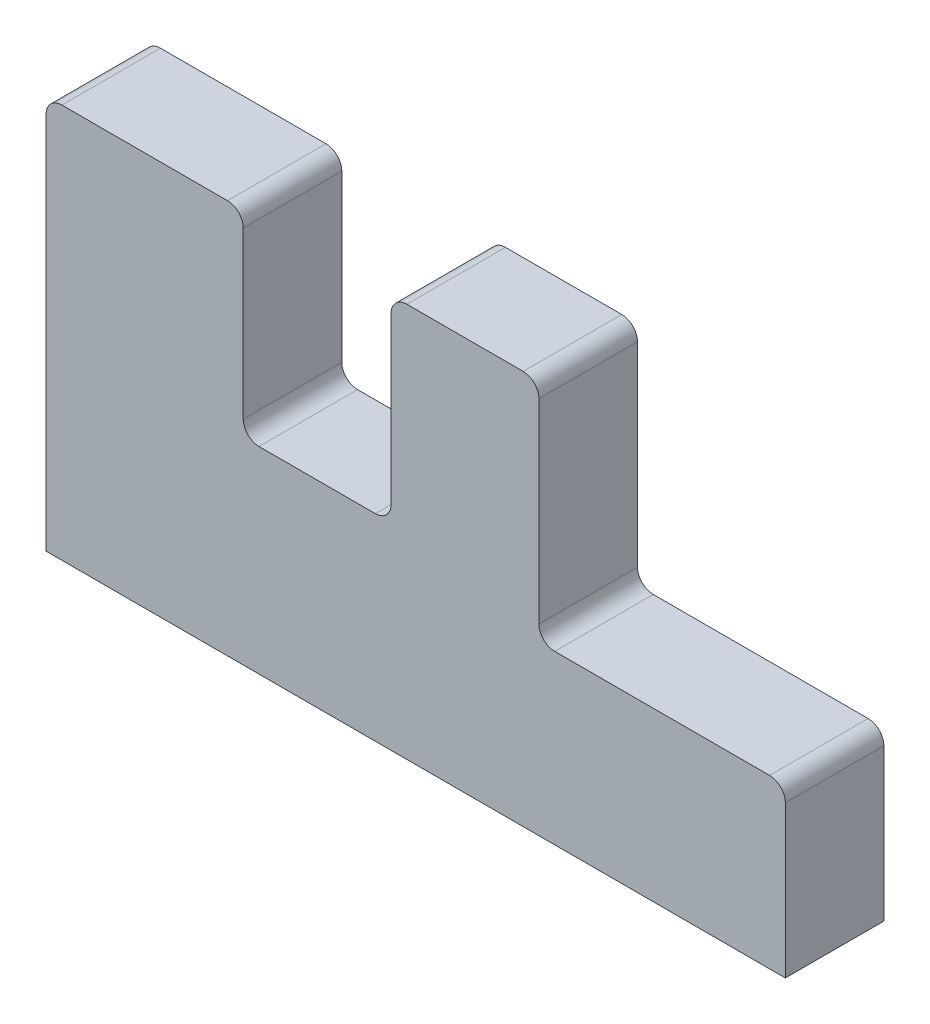
ISO-10303-21;
HEADER;
FILE_DESCRIPTION(('STEP AP214'),'2;1');
FILE_NAME('part.step','',(''),(''),'','','');
FILE_SCHEMA(('AUTOMOTIVE_DESIGN { 1 0 10303 214 1 1 1 1 }'));
ENDSEC;
DATA;
#1=APPLICATION_CONTEXT('core data for automotive mechanical design processes');
#2=APPLICATION_PROTOCOL_DEFINITION('international standard','automotive_design',2000,#1);
#3=PRODUCT_CONTEXT('',#1,'mechanical');
#4=PRODUCT('Part','Part','',(#3));
#5=PRODUCT_RELATED_PRODUCT_CATEGORY('part','',(#4));
#6=PRODUCT_DEFINITION_FORMATION('','',#4);
#7=PRODUCT_DEFINITION_CONTEXT('part definition',#1,'design');
#8=PRODUCT_DEFINITION('design','',#6,#7);
#9=PRODUCT_DEFINITION_SHAPE('','',#8);
#10=(LENGTH_UNIT() NAMED_UNIT(*) SI_UNIT(.MILLI.,.METRE.));
#11=(NAMED_UNIT(*) PLANE_ANGLE_UNIT() SI_UNIT($,.RADIAN.));
#12=(NAMED_UNIT(*) SI_UNIT($,.STERADIAN.) SOLID_ANGLE_UNIT());
#13=UNCERTAINTY_MEASURE_WITH_UNIT(LENGTH_MEASURE(1.E-05),#10,'distance_accuracy_value','');
#14=(GEOMETRIC_REPRESENTATION_CONTEXT(3) GLOBAL_UNCERTAINTY_ASSIGNED_CONTEXT((#13)) GLOBAL_UNIT_ASSIGNED_CONTEXT((#10,
#11,#12)) REPRESENTATION_CONTEXT('',''));
#15=CARTESIAN_POINT('',(0.,0.,0.));
#16=DIRECTION('',(0.,0.,1.));
#17=DIRECTION('',(1.,0.,0.));
#18=AXIS2_PLACEMENT_3D('',#15,#16,#17);
#19=CARTESIAN_POINT('',(3750.,0.,500.));
#20=DIRECTION('',(0.,1.,0.));
#21=DIRECTION('',(0.,0.,1.));
#22=AXIS2_PLACEMENT_3D('',#19,#20,#21);
#23=PLANE('',#22);
#24=DIRECTION('',(1.,0.,0.));
#25=VECTOR('',#24,1.);
#26=CARTESIAN_POINT('',(3750.,0.,0.));
#27=LINE('',#26,#25);
#28=CARTESIAN_POINT('',(0.,0.,0.));
#29=VERTEX_POINT('',#28);
#30=CARTESIAN_POINT('',(3750.,0.,0.));
#31=VERTEX_POINT('',#30);
#32=EDGE_CURVE('E194',#29,#31,#27,.T.);
#33=ORIENTED_EDGE('',*,*,#32,.T.);
#34=DIRECTION('',(0.,0.,-1.));
#35=VECTOR('',#34,1.);
#36=CARTESIAN_POINT('',(3750.,0.,500.));
#37=LINE('',#36,#35);
#38=CARTESIAN_POINT('',(3750.,0.,500.));
#39=VERTEX_POINT('',#38);
#40=EDGE_CURVE('E175',#39,#31,#37,.T.);
#41=ORIENTED_EDGE('',*,*,#40,.F.);
#42=DIRECTION('',(1.,0.,0.));
#43=VECTOR('',#42,1.);
#44=CARTESIAN_POINT('',(3750.,0.,500.));
#45=LINE('',#44,#43);
#46=CARTESIAN_POINT('',(0.,0.,500.));
#47=VERTEX_POINT('',#46);
#48=EDGE_CURVE('E182',#47,#39,#45,.T.);
#49=ORIENTED_EDGE('',*,*,#48,.F.);
#50=DIRECTION('',(0.,0.,-1.));
#51=VECTOR('',#50,1.);
#52=CARTESIAN_POINT('',(0.,0.,500.));
#53=LINE('',#52,#51);
#54=EDGE_CURVE('E197',#47,#29,#53,.T.);
#55=ORIENTED_EDGE('',*,*,#54,.T.);
#56=EDGE_LOOP('',(#33,#41,#49,#55));
#57=FACE_BOUND('',#56,.T.);
#58=ADVANCED_FACE('F43',(#57),#23,.F.);
#59=CARTESIAN_POINT('',(3750.,850.,500.));
#60=DIRECTION('',(-1.,0.,0.));
#61=DIRECTION('',(0.,0.,1.));
#62=AXIS2_PLACEMENT_3D('',#59,#60,#61);
#63=PLANE('',#62);
#64=DIRECTION('',(0.,1.,0.));
#65=VECTOR('',#64,1.);
#66=CARTESIAN_POINT('',(3750.,850.,0.));
#67=LINE('',#66,#65);
#68=CARTESIAN_POINT('',(3750.,770.,0.));
#69=VERTEX_POINT('',#68);
#70=EDGE_CURVE('E314',#31,#69,#67,.T.);
#71=ORIENTED_EDGE('',*,*,#70,.T.);
#72=DIRECTION('',(0.,0.,-1.));
#73=VECTOR('',#72,1.);
#74=CARTESIAN_POINT('',(3750.,770.,500.));
#75=LINE('',#74,#73);
#76=CARTESIAN_POINT('',(3750.,770.,500.));
#77=VERTEX_POINT('',#76);
#78=EDGE_CURVE('E178',#69,#77,#75,.F.);
#79=ORIENTED_EDGE('',*,*,#78,.T.);
#80=DIRECTION('',(0.,1.,0.));
#81=VECTOR('',#80,1.);
#82=CARTESIAN_POINT('',(3750.,850.,500.));
#83=LINE('',#82,#81);
#84=EDGE_CURVE('E170',#39,#77,#83,.T.);
#85=ORIENTED_EDGE('',*,*,#84,.F.);
#86=ORIENTED_EDGE('',*,*,#40,.T.);
#87=EDGE_LOOP('',(#71,#79,#85,#86));
#88=FACE_BOUND('',#87,.T.);
#89=ADVANCED_FACE('F173',(#88),#63,.F.);
#90=CARTESIAN_POINT('',(2500.,850.,500.));
#91=DIRECTION('',(0.,-1.,0.));
#92=DIRECTION('',(0.,0.,-1.));
#93=AXIS2_PLACEMENT_3D('',#90,#91,#92);
#94=PLANE('',#93);
#95=DIRECTION('',(-1.,0.,0.));
#96=VECTOR('',#95,1.);
#97=CARTESIAN_POINT('',(2500.,850.,500.));
#98=LINE('',#97,#96);
#99=CARTESIAN_POINT('',(3670.,850.,500.));
#100=VERTEX_POINT('',#99);
#101=CARTESIAN_POINT('',(2580.,850.,500.));
#102=VERTEX_POINT('',#101);
#103=EDGE_CURVE('E181',#100,#102,#98,.T.);
#104=ORIENTED_EDGE('',*,*,#103,.F.);
#105=DIRECTION('',(0.,0.,-1.));
#106=VECTOR('',#105,1.);
#107=CARTESIAN_POINT('',(3670.,850.,500.));
#108=LINE('',#107,#106);
#109=CARTESIAN_POINT('',(3670.,850.,0.));
#110=VERTEX_POINT('',#109);
#111=EDGE_CURVE('E201',#100,#110,#108,.T.);
#112=ORIENTED_EDGE('',*,*,#111,.T.);
#113=DIRECTION('',(-1.,0.,0.));
#114=VECTOR('',#113,1.);
#115=CARTESIAN_POINT('',(2500.,850.,0.));
#116=LINE('',#115,#114);
#117=CARTESIAN_POINT('',(2580.,850.,0.));
#118=VERTEX_POINT('',#117);
#119=EDGE_CURVE('E302',#110,#118,#116,.T.);
#120=ORIENTED_EDGE('',*,*,#119,.T.);
#121=DIRECTION('',(0.,0.,-1.));
#122=VECTOR('',#121,1.);
#123=CARTESIAN_POINT('',(2580.,850.,500.));
#124=LINE('',#123,#122);
#125=EDGE_CURVE('E196',#118,#102,#124,.F.);
#126=ORIENTED_EDGE('',*,*,#125,.T.);
#127=EDGE_LOOP('',(#104,#112,#120,#126));
#128=FACE_BOUND('',#127,.T.);
#129=ADVANCED_FACE('F310',(#128),#94,.F.);
#130=CARTESIAN_POINT('',(2500.,2000.,500.));
#131=DIRECTION('',(-1.,0.,0.));
#132=DIRECTION('',(0.,0.,1.));
#133=AXIS2_PLACEMENT_3D('',#130,#131,#132);
#134=PLANE('',#133);
#135=DIRECTION('',(0.,1.,0.));
#136=VECTOR('',#135,1.);
#137=CARTESIAN_POINT('',(2500.,2000.,500.));
#138=LINE('',#137,#136);
#139=CARTESIAN_POINT('',(2500.,930.,500.));
#140=VERTEX_POINT('',#139);
#141=CARTESIAN_POINT('',(2500.,1920.,500.));
#142=VERTEX_POINT('',#141);
#143=EDGE_CURVE('E320',#140,#142,#138,.T.);
#144=ORIENTED_EDGE('',*,*,#143,.F.);
#145=DIRECTION('',(0.,0.,-1.));
#146=VECTOR('',#145,1.);
#147=CARTESIAN_POINT('',(2500.,930.,0.));
#148=LINE('',#147,#146);
#149=CARTESIAN_POINT('',(2500.,930.,0.));
#150=VERTEX_POINT('',#149);
#151=EDGE_CURVE('E281',#140,#150,#148,.T.);
#152=ORIENTED_EDGE('',*,*,#151,.T.);
#153=DIRECTION('',(0.,1.,0.));
#154=VECTOR('',#153,1.);
#155=CARTESIAN_POINT('',(2500.,2000.,0.));
#156=LINE('',#155,#154);
#157=CARTESIAN_POINT('',(2500.,1920.,0.));
#158=VERTEX_POINT('',#157);
#159=EDGE_CURVE('E304',#150,#158,#156,.T.);
#160=ORIENTED_EDGE('',*,*,#159,.T.);
#161=DIRECTION('',(0.,0.,-1.));
#162=VECTOR('',#161,1.);
#163=CARTESIAN_POINT('',(2500.,1920.,500.));
#164=LINE('',#163,#162);
#165=EDGE_CURVE('E278',#158,#142,#164,.F.);
#166=ORIENTED_EDGE('',*,*,#165,.T.);
#167=EDGE_LOOP('',(#144,#152,#160,#166));
#168=FACE_BOUND('',#167,.T.);
#169=ADVANCED_FACE('F323',(#168),#134,.F.);
#170=CARTESIAN_POINT('',(1750.,2000.,500.));
#171=DIRECTION('',(0.,-1.,0.));
#172=DIRECTION('',(0.,0.,-1.));
#173=AXIS2_PLACEMENT_3D('',#170,#171,#172);
#174=PLANE('',#173);
#175=DIRECTION('',(-1.,0.,0.));
#176=VECTOR('',#175,1.);
#177=CARTESIAN_POINT('',(1750.,2000.,0.));
#178=LINE('',#177,#176);
#179=CARTESIAN_POINT('',(2420.,2000.,0.));
#180=VERTEX_POINT('',#179);
#181=CARTESIAN_POINT('',(1830.,2000.,0.));
#182=VERTEX_POINT('',#181);
#183=EDGE_CURVE('E357',#180,#182,#178,.T.);
#184=ORIENTED_EDGE('',*,*,#183,.T.);
#185=DIRECTION('',(0.,0.,-1.));
#186=VECTOR('',#185,1.);
#187=CARTESIAN_POINT('',(1830.,2000.,500.));
#188=LINE('',#187,#186);
#189=CARTESIAN_POINT('',(1830.,2000.,500.));
#190=VERTEX_POINT('',#189);
#191=EDGE_CURVE('E275',#182,#190,#188,.F.);
#192=ORIENTED_EDGE('',*,*,#191,.T.);
#193=DIRECTION('',(-1.,0.,0.));
#194=VECTOR('',#193,1.);
#195=CARTESIAN_POINT('',(1750.,2000.,500.));
#196=LINE('',#195,#194);
#197=CARTESIAN_POINT('',(2420.,2000.,500.));
#198=VERTEX_POINT('',#197);
#199=EDGE_CURVE('E326',#198,#190,#196,.T.);
#200=ORIENTED_EDGE('',*,*,#199,.F.);
#201=DIRECTION('',(0.,0.,-1.));
#202=VECTOR('',#201,1.);
#203=CARTESIAN_POINT('',(2420.,2000.,500.));
#204=LINE('',#203,#202);
#205=EDGE_CURVE('E271',#198,#180,#204,.T.);
#206=ORIENTED_EDGE('',*,*,#205,.T.);
#207=EDGE_LOOP('',(#184,#192,#200,#206));
#208=FACE_BOUND('',#207,.T.);
#209=ADVANCED_FACE('F404',(#208),#174,.F.);
#210=CARTESIAN_POINT('',(1750.,1000.,500.));
#211=DIRECTION('',(1.,0.,0.));
#212=DIRECTION('',(0.,0.,-1.));
#213=AXIS2_PLACEMENT_3D('',#210,#211,#212);
#214=PLANE('',#213);
#215=DIRECTION('',(0.,-1.,0.));
#216=VECTOR('',#215,1.);
#217=CARTESIAN_POINT('',(1750.,1000.,0.));
#218=LINE('',#217,#216);
#219=CARTESIAN_POINT('',(1750.,1920.,0.));
#220=VERTEX_POINT('',#219);
#221=CARTESIAN_POINT('',(1750.,1080.,0.));
#222=VERTEX_POINT('',#221);
#223=EDGE_CURVE('E361',#220,#222,#218,.T.);
#224=ORIENTED_EDGE('',*,*,#223,.T.);
#225=DIRECTION('',(0.,0.,-1.));
#226=VECTOR('',#225,1.);
#227=CARTESIAN_POINT('',(1750.,1080.,500.));
#228=LINE('',#227,#226);
#229=CARTESIAN_POINT('',(1750.,1080.,500.));
#230=VERTEX_POINT('',#229);
#231=EDGE_CURVE('E268',#222,#230,#228,.F.);
#232=ORIENTED_EDGE('',*,*,#231,.T.);
#233=DIRECTION('',(0.,-1.,0.));
#234=VECTOR('',#233,1.);
#235=CARTESIAN_POINT('',(1750.,1000.,500.));
#236=LINE('',#235,#234);
#237=CARTESIAN_POINT('',(1750.,1920.,500.));
#238=VERTEX_POINT('',#237);
#239=EDGE_CURVE('E331',#238,#230,#236,.T.);
#240=ORIENTED_EDGE('',*,*,#239,.F.);
#241=DIRECTION('',(0.,0.,-1.));
#242=VECTOR('',#241,1.);
#243=CARTESIAN_POINT('',(1750.,1920.,500.));
#244=LINE('',#243,#242);
#245=EDGE_CURVE('E264',#238,#220,#244,.T.);
#246=ORIENTED_EDGE('',*,*,#245,.T.);
#247=EDGE_LOOP('',(#224,#232,#240,#246));
#248=FACE_BOUND('',#247,.T.);
#249=ADVANCED_FACE('F407',(#248),#214,.F.);
#250=CARTESIAN_POINT('',(1000.,1000.,500.));
#251=DIRECTION('',(0.,-1.,0.));
#252=DIRECTION('',(1.,0.,0.));
#253=AXIS2_PLACEMENT_3D('',#250,#251,#252);
#254=PLANE('',#253);
#255=DIRECTION('',(-1.,0.,0.));
#256=VECTOR('',#255,1.);
#257=CARTESIAN_POINT('',(1000.,1000.,0.));
#258=LINE('',#257,#256);
#259=CARTESIAN_POINT('',(1670.,1000.,0.));
#260=VERTEX_POINT('',#259);
#261=CARTESIAN_POINT('',(1080.,1000.,0.));
#262=VERTEX_POINT('',#261);
#263=EDGE_CURVE('E365',#260,#262,#258,.T.);
#264=ORIENTED_EDGE('',*,*,#263,.T.);
#265=DIRECTION('',(0.,0.,-1.));
#266=VECTOR('',#265,1.);
#267=CARTESIAN_POINT('',(1080.,1000.,500.));
#268=LINE('',#267,#266);
#269=CARTESIAN_POINT('',(1080.,1000.,500.));
#270=VERTEX_POINT('',#269);
#271=EDGE_CURVE('E261',#262,#270,#268,.F.);
#272=ORIENTED_EDGE('',*,*,#271,.T.);
#273=DIRECTION('',(-1.,0.,0.));
#274=VECTOR('',#273,1.);
#275=CARTESIAN_POINT('',(1000.,1000.,500.));
#276=LINE('',#275,#274);
#277=CARTESIAN_POINT('',(1670.,1000.,500.));
#278=VERTEX_POINT('',#277);
#279=EDGE_CURVE('E338',#278,#270,#276,.T.);
#280=ORIENTED_EDGE('',*,*,#279,.F.);
#281=DIRECTION('',(0.,0.,-1.));
#282=VECTOR('',#281,1.);
#283=CARTESIAN_POINT('',(1670.,1000.,0.));
#284=LINE('',#283,#282);
#285=EDGE_CURVE('E257',#278,#260,#284,.T.);
#286=ORIENTED_EDGE('',*,*,#285,.T.);
#287=EDGE_LOOP('',(#264,#272,#280,#286));
#288=FACE_BOUND('',#287,.T.);
#289=ADVANCED_FACE('F411',(#288),#254,.F.);
#290=CARTESIAN_POINT('',(1000.,2000.,500.));
#291=DIRECTION('',(-1.,0.,0.));
#292=DIRECTION('',(0.,-1.,0.));
#293=AXIS2_PLACEMENT_3D('',#290,#291,#292);
#294=PLANE('',#293);
#295=DIRECTION('',(0.,1.,0.));
#296=VECTOR('',#295,1.);
#297=CARTESIAN_POINT('',(1000.,2000.,0.));
#298=LINE('',#297,#296);
#299=CARTESIAN_POINT('',(1000.,1080.,0.));
#300=VERTEX_POINT('',#299);
#301=CARTESIAN_POINT('',(1000.,1920.,0.));
#302=VERTEX_POINT('',#301);
#303=EDGE_CURVE('E369',#300,#302,#298,.T.);
#304=ORIENTED_EDGE('',*,*,#303,.T.);
#305=DIRECTION('',(0.,0.,-1.));
#306=VECTOR('',#305,1.);
#307=CARTESIAN_POINT('',(1000.,1920.,500.));
#308=LINE('',#307,#306);
#309=CARTESIAN_POINT('',(1000.,1920.,500.));
#310=VERTEX_POINT('',#309);
#311=EDGE_CURVE('E254',#302,#310,#308,.F.);
#312=ORIENTED_EDGE('',*,*,#311,.T.);
#313=DIRECTION('',(0.,1.,0.));
#314=VECTOR('',#313,1.);
#315=CARTESIAN_POINT('',(1000.,2000.,500.));
#316=LINE('',#315,#314);
#317=CARTESIAN_POINT('',(1000.,1080.,500.));
#318=VERTEX_POINT('',#317);
#319=EDGE_CURVE('E342',#318,#310,#316,.T.);
#320=ORIENTED_EDGE('',*,*,#319,.F.);
#321=DIRECTION('',(0.,0.,-1.));
#322=VECTOR('',#321,1.);
#323=CARTESIAN_POINT('',(1000.,1080.,0.));
#324=LINE('',#323,#322);
#325=EDGE_CURVE('E250',#318,#300,#324,.T.);
#326=ORIENTED_EDGE('',*,*,#325,.T.);
#327=EDGE_LOOP('',(#304,#312,#320,#326));
#328=FACE_BOUND('',#327,.T.);
#329=ADVANCED_FACE('F415',(#328),#294,.F.);
#330=CARTESIAN_POINT('',(0.,2000.,500.));
#331=DIRECTION('',(0.,-1.,0.));
#332=DIRECTION('',(0.,0.,-1.));
#333=AXIS2_PLACEMENT_3D('',#330,#331,#332);
#334=PLANE('',#333);
#335=DIRECTION('',(-1.,0.,0.));
#336=VECTOR('',#335,1.);
#337=CARTESIAN_POINT('',(0.,2000.,0.));
#338=LINE('',#337,#336);
#339=CARTESIAN_POINT('',(920.,2000.,0.));
#340=VERTEX_POINT('',#339);
#341=CARTESIAN_POINT('',(80.,2000.,0.));
#342=VERTEX_POINT('',#341);
#343=EDGE_CURVE('E373',#340,#342,#338,.T.);
#344=ORIENTED_EDGE('',*,*,#343,.T.);
#345=DIRECTION('',(0.,0.,-1.));
#346=VECTOR('',#345,1.);
#347=CARTESIAN_POINT('',(80.,2000.,500.));
#348=LINE('',#347,#346);
#349=CARTESIAN_POINT('',(80.,2000.,500.));
#350=VERTEX_POINT('',#349);
#351=EDGE_CURVE('E67',#342,#350,#348,.F.);
#352=ORIENTED_EDGE('',*,*,#351,.T.);
#353=DIRECTION('',(-1.,0.,0.));
#354=VECTOR('',#353,1.);
#355=CARTESIAN_POINT('',(0.,2000.,500.));
#356=LINE('',#355,#354);
#357=CARTESIAN_POINT('',(920.,2000.,500.));
#358=VERTEX_POINT('',#357);
#359=EDGE_CURVE('E346',#358,#350,#356,.T.);
#360=ORIENTED_EDGE('',*,*,#359,.F.);
#361=DIRECTION('',(0.,0.,-1.));
#362=VECTOR('',#361,1.);
#363=CARTESIAN_POINT('',(920.,2000.,500.));
#364=LINE('',#363,#362);
#365=EDGE_CURVE('E244',#358,#340,#364,.T.);
#366=ORIENTED_EDGE('',*,*,#365,.T.);
#367=EDGE_LOOP('',(#344,#352,#360,#366));
#368=FACE_BOUND('',#367,.T.);
#369=ADVANCED_FACE('F419',(#368),#334,.F.);
#370=CARTESIAN_POINT('',(0.,0.,500.));
#371=DIRECTION('',(1.,0.,0.));
#372=DIRECTION('',(0.,0.,-1.));
#373=AXIS2_PLACEMENT_3D('',#370,#371,#372);
#374=PLANE('',#373);
#375=DIRECTION('',(0.,-1.,0.));
#376=VECTOR('',#375,1.);
#377=CARTESIAN_POINT('',(0.,0.,500.));
#378=LINE('',#377,#376);
#379=CARTESIAN_POINT('',(0.,1920.,500.));
#380=VERTEX_POINT('',#379);
#381=EDGE_CURVE('E186',#380,#47,#378,.T.);
#382=ORIENTED_EDGE('',*,*,#381,.F.);
#383=DIRECTION('',(0.,0.,-1.));
#384=VECTOR('',#383,1.);
#385=CARTESIAN_POINT('',(0.,1920.,500.));
#386=LINE('',#385,#384);
#387=CARTESIAN_POINT('',(0.,1920.,0.));
#388=VERTEX_POINT('',#387);
#389=EDGE_CURVE('E240',#380,#388,#386,.T.);
#390=ORIENTED_EDGE('',*,*,#389,.T.);
#391=DIRECTION('',(0.,-1.,0.));
#392=VECTOR('',#391,1.);
#393=CARTESIAN_POINT('',(0.,0.,0.));
#394=LINE('',#393,#392);
#395=EDGE_CURVE('E191',#388,#29,#394,.T.);
#396=ORIENTED_EDGE('',*,*,#395,.T.);
#397=ORIENTED_EDGE('',*,*,#54,.F.);
#398=EDGE_LOOP('',(#382,#390,#396,#397));
#399=FACE_BOUND('',#398,.T.);
#400=ADVANCED_FACE('F378',(#399),#374,.F.);
#401=CARTESIAN_POINT('',(0.,0.,500.));
#402=DIRECTION('',(0.,0.,-1.));
#403=DIRECTION('',(-1.,0.,0.));
#404=AXIS2_PLACEMENT_3D('',#401,#402,#403);
#405=PLANE('',#404);
#406=ORIENTED_EDGE('',*,*,#84,.T.);
#407=CARTESIAN_POINT('',(3670.,770.,500.));
#408=DIRECTION('',(0.,0.,-1.));
#409=DIRECTION('',(-1.,0.,0.));
#410=AXIS2_PLACEMENT_3D('',#407,#408,#409);
#411=CIRCLE('',#410,80.);
#412=EDGE_CURVE('E237',#77,#100,#411,.F.);
#413=ORIENTED_EDGE('',*,*,#412,.T.);
#414=ORIENTED_EDGE('',*,*,#103,.T.);
#415=CARTESIAN_POINT('',(2580.,930.,500.));
#416=DIRECTION('',(0.,0.,-1.));
#417=DIRECTION('',(-1.,0.,0.));
#418=AXIS2_PLACEMENT_3D('',#415,#416,#417);
#419=CIRCLE('',#418,80.);
#420=EDGE_CURVE('E11',#102,#140,#419,.T.);
#421=ORIENTED_EDGE('',*,*,#420,.T.);
#422=ORIENTED_EDGE('',*,*,#143,.T.);
#423=CARTESIAN_POINT('',(2420.,1920.,500.));
#424=DIRECTION('',(0.,0.,-1.));
#425=DIRECTION('',(-1.,0.,0.));
#426=AXIS2_PLACEMENT_3D('',#423,#424,#425);
#427=CIRCLE('',#426,80.);
#428=EDGE_CURVE('E226',#142,#198,#427,.F.);
#429=ORIENTED_EDGE('',*,*,#428,.T.);
#430=ORIENTED_EDGE('',*,*,#199,.T.);
#431=CARTESIAN_POINT('',(1830.,1920.,500.));
#432=DIRECTION('',(0.,0.,-1.));
#433=DIRECTION('',(-1.,0.,0.));
#434=AXIS2_PLACEMENT_3D('',#431,#432,#433);
#435=CIRCLE('',#434,80.);
#436=EDGE_CURVE('E229',#190,#238,#435,.F.);
#437=ORIENTED_EDGE('',*,*,#436,.T.);
#438=ORIENTED_EDGE('',*,*,#239,.T.);
#439=CARTESIAN_POINT('',(1670.,1080.,500.));
#440=DIRECTION('',(0.,0.,-1.));
#441=DIRECTION('',(-1.,0.,0.));
#442=AXIS2_PLACEMENT_3D('',#439,#440,#441);
#443=CIRCLE('',#442,80.);
#444=EDGE_CURVE('E294',#230,#278,#443,.T.);
#445=ORIENTED_EDGE('',*,*,#444,.T.);
#446=ORIENTED_EDGE('',*,*,#279,.T.);
#447=CARTESIAN_POINT('',(1080.,1080.,500.));
#448=DIRECTION('',(0.,0.,-1.));
#449=DIRECTION('',(-1.,0.,0.));
#450=AXIS2_PLACEMENT_3D('',#447,#448,#449);
#451=CIRCLE('',#450,80.);
#452=EDGE_CURVE('E288',#270,#318,#451,.T.);
#453=ORIENTED_EDGE('',*,*,#452,.T.);
#454=ORIENTED_EDGE('',*,*,#319,.T.);
#455=CARTESIAN_POINT('',(920.,1920.,500.));
#456=DIRECTION('',(0.,0.,-1.));
#457=DIRECTION('',(-1.,0.,0.));
#458=AXIS2_PLACEMENT_3D('',#455,#456,#457);
#459=CIRCLE('',#458,80.);
#460=EDGE_CURVE('E232',#310,#358,#459,.F.);
#461=ORIENTED_EDGE('',*,*,#460,.T.);
#462=ORIENTED_EDGE('',*,*,#359,.T.);
#463=CARTESIAN_POINT('',(80.,1920.,500.));
#464=DIRECTION('',(0.,0.,-1.));
#465=DIRECTION('',(-1.,0.,0.));
#466=AXIS2_PLACEMENT_3D('',#463,#464,#465);
#467=CIRCLE('',#466,80.);
#468=EDGE_CURVE('E59',#350,#380,#467,.F.);
#469=ORIENTED_EDGE('',*,*,#468,.T.);
#470=ORIENTED_EDGE('',*,*,#381,.T.);
#471=ORIENTED_EDGE('',*,*,#48,.T.);
#472=EDGE_LOOP('',(#406,#413,#414,#421,#422,#429,#430,#437,#438,#445,#446,#453,#454,#461,#462,
#469,#470,#471));
#473=FACE_BOUND('',#472,.T.);
#474=ADVANCED_FACE('F185',(#473),#405,.F.);
#475=CARTESIAN_POINT('',(0.,0.,0.));
#476=DIRECTION('',(0.,0.,-1.));
#477=DIRECTION('',(-1.,0.,0.));
#478=AXIS2_PLACEMENT_3D('',#475,#476,#477);
#479=PLANE('',#478);
#480=ORIENTED_EDGE('',*,*,#119,.F.);
#481=CARTESIAN_POINT('',(3670.,770.,0.));
#482=DIRECTION('',(0.,0.,-1.));
#483=DIRECTION('',(-1.,0.,0.));
#484=AXIS2_PLACEMENT_3D('',#481,#482,#483);
#485=CIRCLE('',#484,80.);
#486=EDGE_CURVE('E221',#110,#69,#485,.T.);
#487=ORIENTED_EDGE('',*,*,#486,.T.);
#488=ORIENTED_EDGE('',*,*,#70,.F.);
#489=ORIENTED_EDGE('',*,*,#32,.F.);
#490=ORIENTED_EDGE('',*,*,#395,.F.);
#491=CARTESIAN_POINT('',(80.,1920.,0.));
#492=DIRECTION('',(0.,0.,-1.));
#493=DIRECTION('',(-1.,0.,0.));
#494=AXIS2_PLACEMENT_3D('',#491,#492,#493);
#495=CIRCLE('',#494,80.);
#496=EDGE_CURVE('E218',#388,#342,#495,.T.);
#497=ORIENTED_EDGE('',*,*,#496,.T.);
#498=ORIENTED_EDGE('',*,*,#343,.F.);
#499=CARTESIAN_POINT('',(920.,1920.,0.));
#500=DIRECTION('',(0.,0.,-1.));
#501=DIRECTION('',(-1.,0.,0.));
#502=AXIS2_PLACEMENT_3D('',#499,#500,#501);
#503=CIRCLE('',#502,80.);
#504=EDGE_CURVE('E215',#340,#302,#503,.T.);
#505=ORIENTED_EDGE('',*,*,#504,.T.);
#506=ORIENTED_EDGE('',*,*,#303,.F.);
#507=CARTESIAN_POINT('',(1080.,1080.,0.));
#508=DIRECTION('',(0.,0.,-1.));
#509=DIRECTION('',(-1.,0.,0.));
#510=AXIS2_PLACEMENT_3D('',#507,#508,#509);
#511=CIRCLE('',#510,80.);
#512=EDGE_CURVE('E285',#300,#262,#511,.F.);
#513=ORIENTED_EDGE('',*,*,#512,.T.);
#514=ORIENTED_EDGE('',*,*,#263,.F.);
#515=CARTESIAN_POINT('',(1670.,1080.,0.));
#516=DIRECTION('',(0.,0.,-1.));
#517=DIRECTION('',(-1.,0.,0.));
#518=AXIS2_PLACEMENT_3D('',#515,#516,#517);
#519=CIRCLE('',#518,80.);
#520=EDGE_CURVE('E291',#260,#222,#519,.F.);
#521=ORIENTED_EDGE('',*,*,#520,.T.);
#522=ORIENTED_EDGE('',*,*,#223,.F.);
#523=CARTESIAN_POINT('',(1830.,1920.,0.));
#524=DIRECTION('',(0.,0.,-1.));
#525=DIRECTION('',(-1.,0.,0.));
#526=AXIS2_PLACEMENT_3D('',#523,#524,#525);
#527=CIRCLE('',#526,80.);
#528=EDGE_CURVE('E212',#220,#182,#527,.T.);
#529=ORIENTED_EDGE('',*,*,#528,.T.);
#530=ORIENTED_EDGE('',*,*,#183,.F.);
#531=CARTESIAN_POINT('',(2420.,1920.,0.));
#532=DIRECTION('',(0.,0.,-1.));
#533=DIRECTION('',(-1.,0.,0.));
#534=AXIS2_PLACEMENT_3D('',#531,#532,#533);
#535=CIRCLE('',#534,80.);
#536=EDGE_CURVE('E209',#180,#158,#535,.T.);
#537=ORIENTED_EDGE('',*,*,#536,.T.);
#538=ORIENTED_EDGE('',*,*,#159,.F.);
#539=CARTESIAN_POINT('',(2580.,930.,0.));
#540=DIRECTION('',(0.,0.,-1.));
#541=DIRECTION('',(-1.,0.,0.));
#542=AXIS2_PLACEMENT_3D('',#539,#540,#541);
#543=CIRCLE('',#542,80.);
#544=EDGE_CURVE('E52',#150,#118,#543,.F.);
#545=ORIENTED_EDGE('',*,*,#544,.T.);
#546=EDGE_LOOP('',(#480,#487,#488,#489,#490,#497,#498,#505,#506,#513,#514,#521,#522,#529,#530,
#537,#538,#545));
#547=FACE_BOUND('',#546,.T.);
#548=ADVANCED_FACE('F301',(#547),#479,.T.);
#549=CARTESIAN_POINT('',(3670.,770.,500.));
#550=DIRECTION('',(0.,0.,-1.));
#551=DIRECTION('',(-1.,0.,0.));
#552=AXIS2_PLACEMENT_3D('',#549,#550,#551);
#553=CYLINDRICAL_SURFACE('',#552,80.);
#554=ORIENTED_EDGE('',*,*,#412,.F.);
#555=ORIENTED_EDGE('',*,*,#78,.F.);
#556=ORIENTED_EDGE('',*,*,#486,.F.);
#557=ORIENTED_EDGE('',*,*,#111,.F.);
#558=EDGE_LOOP('',(#554,#555,#556,#557));
#559=FACE_BOUND('',#558,.T.);
#560=ADVANCED_FACE('F381',(#559),#553,.T.);
#561=CARTESIAN_POINT('',(80.,1920.,500.));
#562=DIRECTION('',(0.,0.,-1.));
#563=DIRECTION('',(-1.,0.,0.));
#564=AXIS2_PLACEMENT_3D('',#561,#562,#563);
#565=CYLINDRICAL_SURFACE('',#564,80.);
#566=ORIENTED_EDGE('',*,*,#468,.F.);
#567=ORIENTED_EDGE('',*,*,#351,.F.);
#568=ORIENTED_EDGE('',*,*,#496,.F.);
#569=ORIENTED_EDGE('',*,*,#389,.F.);
#570=EDGE_LOOP('',(#566,#567,#568,#569));
#571=FACE_BOUND('',#570,.T.);
#572=ADVANCED_FACE('F383',(#571),#565,.T.);
#573=CARTESIAN_POINT('',(920.,1920.,500.));
#574=DIRECTION('',(0.,0.,-1.));
#575=DIRECTION('',(-1.,0.,0.));
#576=AXIS2_PLACEMENT_3D('',#573,#574,#575);
#577=CYLINDRICAL_SURFACE('',#576,80.);
#578=ORIENTED_EDGE('',*,*,#460,.F.);
#579=ORIENTED_EDGE('',*,*,#311,.F.);
#580=ORIENTED_EDGE('',*,*,#504,.F.);
#581=ORIENTED_EDGE('',*,*,#365,.F.);
#582=EDGE_LOOP('',(#578,#579,#580,#581));
#583=FACE_BOUND('',#582,.T.);
#584=ADVANCED_FACE('F389',(#583),#577,.T.);
#585=CARTESIAN_POINT('',(1080.,1080.,500.));
#586=DIRECTION('',(0.,0.,1.));
#587=DIRECTION('',(1.,0.,0.));
#588=AXIS2_PLACEMENT_3D('',#585,#586,#587);
#589=CYLINDRICAL_SURFACE('',#588,80.);
#590=ORIENTED_EDGE('',*,*,#452,.F.);
#591=ORIENTED_EDGE('',*,*,#271,.F.);
#592=ORIENTED_EDGE('',*,*,#512,.F.);
#593=ORIENTED_EDGE('',*,*,#325,.F.);
#594=EDGE_LOOP('',(#590,#591,#592,#593));
#595=FACE_BOUND('',#594,.T.);
#596=ADVANCED_FACE('F456',(#595),#589,.F.);
#597=CARTESIAN_POINT('',(1670.,1080.,500.));
#598=DIRECTION('',(0.,0.,1.));
#599=DIRECTION('',(1.,0.,0.));
#600=AXIS2_PLACEMENT_3D('',#597,#598,#599);
#601=CYLINDRICAL_SURFACE('',#600,80.);
#602=ORIENTED_EDGE('',*,*,#444,.F.);
#603=ORIENTED_EDGE('',*,*,#231,.F.);
#604=ORIENTED_EDGE('',*,*,#520,.F.);
#605=ORIENTED_EDGE('',*,*,#285,.F.);
#606=EDGE_LOOP('',(#602,#603,#604,#605));
#607=FACE_BOUND('',#606,.T.);
#608=ADVANCED_FACE('F467',(#607),#601,.F.);
#609=CARTESIAN_POINT('',(1830.,1920.,500.));
#610=DIRECTION('',(0.,0.,-1.));
#611=DIRECTION('',(-1.,0.,0.));
#612=AXIS2_PLACEMENT_3D('',#609,#610,#611);
#613=CYLINDRICAL_SURFACE('',#612,80.);
#614=ORIENTED_EDGE('',*,*,#436,.F.);
#615=ORIENTED_EDGE('',*,*,#191,.F.);
#616=ORIENTED_EDGE('',*,*,#528,.F.);
#617=ORIENTED_EDGE('',*,*,#245,.F.);
#618=EDGE_LOOP('',(#614,#615,#616,#617));
#619=FACE_BOUND('',#618,.T.);
#620=ADVANCED_FACE('F478',(#619),#613,.T.);
#621=CARTESIAN_POINT('',(2580.,930.,500.));
#622=DIRECTION('',(0.,0.,1.));
#623=DIRECTION('',(1.,0.,0.));
#624=AXIS2_PLACEMENT_3D('',#621,#622,#623);
#625=CYLINDRICAL_SURFACE('',#624,80.);
#626=ORIENTED_EDGE('',*,*,#420,.F.);
#627=ORIENTED_EDGE('',*,*,#125,.F.);
#628=ORIENTED_EDGE('',*,*,#544,.F.);
#629=ORIENTED_EDGE('',*,*,#151,.F.);
#630=EDGE_LOOP('',(#626,#627,#628,#629));
#631=FACE_BOUND('',#630,.T.);
#632=ADVANCED_FACE('F317',(#631),#625,.F.);
#633=CARTESIAN_POINT('',(2420.,1920.,500.));
#634=DIRECTION('',(0.,0.,-1.));
#635=DIRECTION('',(-1.,0.,0.));
#636=AXIS2_PLACEMENT_3D('',#633,#634,#635);
#637=CYLINDRICAL_SURFACE('',#636,80.);
#638=ORIENTED_EDGE('',*,*,#428,.F.);
#639=ORIENTED_EDGE('',*,*,#165,.F.);
#640=ORIENTED_EDGE('',*,*,#536,.F.);
#641=ORIENTED_EDGE('',*,*,#205,.F.);
#642=EDGE_LOOP('',(#638,#639,#640,#641));
#643=FACE_BOUND('',#642,.T.);
#644=ADVANCED_FACE('F45',(#643),#637,.T.);
#645=CLOSED_SHELL('',(#58,#89,#129,#169,#209,#249,#289,#329,#369,#400,#474,#548,#560,#572,#584,
#596,#608,#620,#632,#644));
#646=MANIFOLD_SOLID_BREP('B2',#645);
#647=ADVANCED_BREP_SHAPE_REPRESENTATION('',(#18,#646),#14);
#648=SHAPE_DEFINITION_REPRESENTATION(#9,#647);
ENDSEC;
END-ISO-10303-21;
